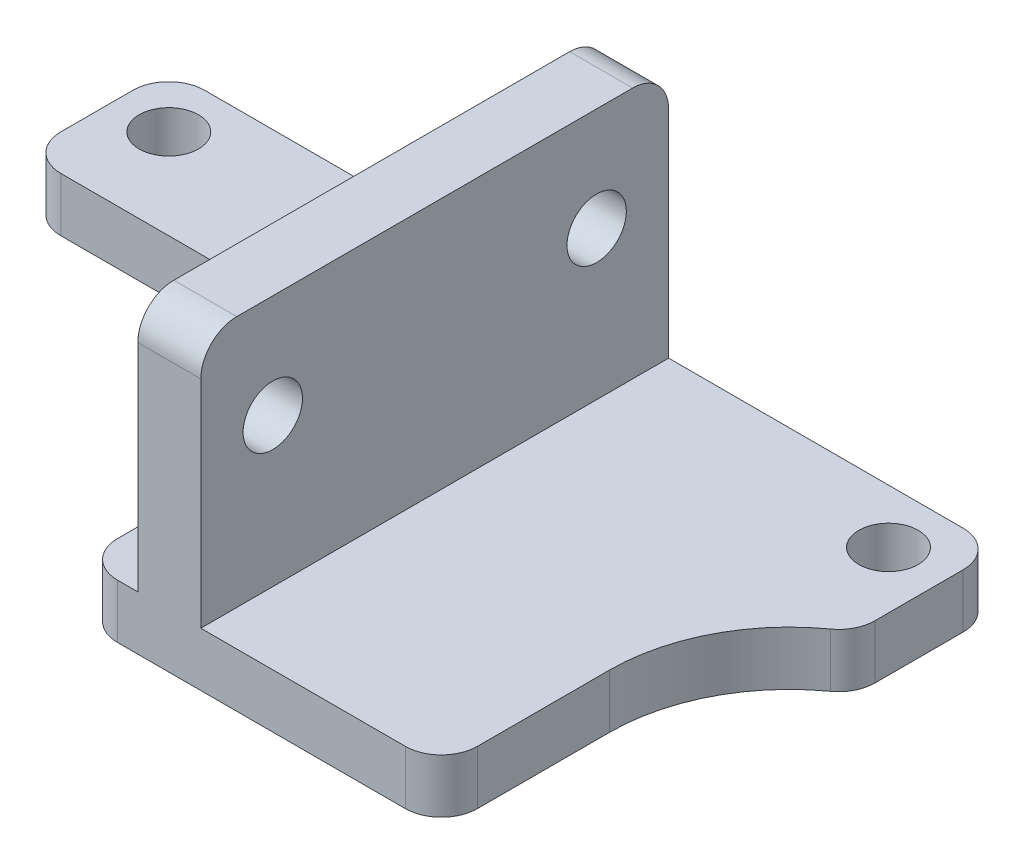
ISO-10303-21;
HEADER;
FILE_DESCRIPTION(('STEP AP214'),'2;1');
FILE_NAME('part.step','',(''),(''),'','','');
FILE_SCHEMA(('AUTOMOTIVE_DESIGN { 1 0 10303 214 1 1 1 1 }'));
ENDSEC;
DATA;
#1=APPLICATION_CONTEXT('core data for automotive mechanical design processes');
#2=APPLICATION_PROTOCOL_DEFINITION('international standard','automotive_design',2000,#1);
#3=PRODUCT_CONTEXT('',#1,'mechanical');
#4=PRODUCT('Part','Part','',(#3));
#5=PRODUCT_RELATED_PRODUCT_CATEGORY('part','',(#4));
#6=PRODUCT_DEFINITION_FORMATION('','',#4);
#7=PRODUCT_DEFINITION_CONTEXT('part definition',#1,'design');
#8=PRODUCT_DEFINITION('design','',#6,#7);
#9=PRODUCT_DEFINITION_SHAPE('','',#8);
#10=(LENGTH_UNIT() NAMED_UNIT(*) SI_UNIT(.MILLI.,.METRE.));
#11=(NAMED_UNIT(*) PLANE_ANGLE_UNIT() SI_UNIT($,.RADIAN.));
#12=(NAMED_UNIT(*) SI_UNIT($,.STERADIAN.) SOLID_ANGLE_UNIT());
#13=UNCERTAINTY_MEASURE_WITH_UNIT(LENGTH_MEASURE(1.E-05),#10,'distance_accuracy_value','');
#14=(GEOMETRIC_REPRESENTATION_CONTEXT(3) GLOBAL_UNCERTAINTY_ASSIGNED_CONTEXT((#13)) GLOBAL_UNIT_ASSIGNED_CONTEXT((#10,
#11,#12)) REPRESENTATION_CONTEXT('',''));
#15=CARTESIAN_POINT('',(0.,0.,0.));
#16=DIRECTION('',(0.,0.,1.));
#17=DIRECTION('',(1.,0.,0.));
#18=AXIS2_PLACEMENT_3D('',#15,#16,#17);
#19=CARTESIAN_POINT('',(0.,3.,26.));
#20=DIRECTION('',(1.,0.,0.));
#21=DIRECTION('',(0.,0.,-1.));
#22=AXIS2_PLACEMENT_3D('',#19,#20,#21);
#23=PLANE('',#22);
#24=DIRECTION('',(0.,0.,1.));
#25=VECTOR('',#24,1.);
#26=CARTESIAN_POINT('',(0.,0.,26.));
#27=LINE('',#26,#25);
#28=CARTESIAN_POINT('',(0.,0.,18.));
#29=VERTEX_POINT('',#28);
#30=CARTESIAN_POINT('',(0.,0.,24.));
#31=VERTEX_POINT('',#30);
#32=EDGE_CURVE('E313',#29,#31,#27,.T.);
#33=ORIENTED_EDGE('',*,*,#32,.T.);
#34=DIRECTION('',(0.,-1.,0.));
#35=VECTOR('',#34,1.);
#36=CARTESIAN_POINT('',(0.,3.,24.));
#37=LINE('',#36,#35);
#38=CARTESIAN_POINT('',(0.,3.,24.));
#39=VERTEX_POINT('',#38);
#40=EDGE_CURVE('E225',#31,#39,#37,.F.);
#41=ORIENTED_EDGE('',*,*,#40,.T.);
#42=DIRECTION('',(0.,0.,1.));
#43=VECTOR('',#42,1.);
#44=CARTESIAN_POINT('',(0.,3.,26.));
#45=LINE('',#44,#43);
#46=CARTESIAN_POINT('',(0.,3.,18.));
#47=VERTEX_POINT('',#46);
#48=EDGE_CURVE('E304',#47,#39,#45,.T.);
#49=ORIENTED_EDGE('',*,*,#48,.F.);
#50=DIRECTION('',(0.,1.,0.));
#51=VECTOR('',#50,1.);
#52=CARTESIAN_POINT('',(0.,3.,18.));
#53=LINE('',#52,#51);
#54=EDGE_CURVE('E295',#47,#29,#53,.F.);
#55=ORIENTED_EDGE('',*,*,#54,.T.);
#56=EDGE_LOOP('',(#33,#41,#49,#55));
#57=FACE_BOUND('',#56,.T.);
#58=ADVANCED_FACE('F41',(#57),#23,.F.);
#59=CARTESIAN_POINT('',(0.,3.,0.));
#60=DIRECTION('',(0.,-1.,0.));
#61=DIRECTION('',(0.,0.,-1.));
#62=AXIS2_PLACEMENT_3D('',#59,#60,#61);
#63=PLANE('',#62);
#64=DIRECTION('',(0.,0.,1.));
#65=VECTOR('',#64,1.);
#66=CARTESIAN_POINT('',(3.13,3.,26.));
#67=LINE('',#66,#65);
#68=CARTESIAN_POINT('',(3.13,3.,5.74989593923522));
#69=VERTEX_POINT('',#68);
#70=CARTESIAN_POINT('',(3.13,3.,26.));
#71=VERTEX_POINT('',#70);
#72=EDGE_CURVE('E351',#69,#71,#67,.T.);
#73=ORIENTED_EDGE('',*,*,#72,.F.);
#74=CARTESIAN_POINT('',(3.15392328073625,3.,2.99999999999701));
#75=DIRECTION('',(0.,-1.,0.));
#76=DIRECTION('',(0.,0.,-1.));
#77=AXIS2_PLACEMENT_3D('',#74,#75,#76);
#78=CIRCLE('',#77,2.75);
#79=CARTESIAN_POINT('',(3.13,3.,0.250104060758797));
#80=VERTEX_POINT('',#79);
#81=EDGE_CURVE('E203',#69,#80,#78,.T.);
#82=ORIENTED_EDGE('',*,*,#81,.T.);
#83=CARTESIAN_POINT('',(3.13,3.,0.));
#84=VERTEX_POINT('',#83);
#85=EDGE_CURVE('E209',#84,#80,#67,.T.);
#86=ORIENTED_EDGE('',*,*,#85,.F.);
#87=DIRECTION('',(-1.,0.,0.));
#88=VECTOR('',#87,1.);
#89=CARTESIAN_POINT('',(0.,3.,0.));
#90=LINE('',#89,#88);
#91=CARTESIAN_POINT('',(-19.15,3.,0.));
#92=VERTEX_POINT('',#91);
#93=EDGE_CURVE('E319',#84,#92,#90,.T.);
#94=ORIENTED_EDGE('',*,*,#93,.T.);
#95=CARTESIAN_POINT('',(-19.15,3.,2.));
#96=DIRECTION('',(0.,-1.,0.));
#97=DIRECTION('',(0.,0.,-1.));
#98=AXIS2_PLACEMENT_3D('',#95,#96,#97);
#99=CIRCLE('',#98,2.);
#100=CARTESIAN_POINT('',(-21.15,3.,2.));
#101=VERTEX_POINT('',#100);
#102=EDGE_CURVE('E223',#92,#101,#99,.F.);
#103=ORIENTED_EDGE('',*,*,#102,.T.);
#104=DIRECTION('',(0.,0.,1.));
#105=VECTOR('',#104,1.);
#106=CARTESIAN_POINT('',(-21.15,3.,0.));
#107=LINE('',#106,#105);
#108=CARTESIAN_POINT('',(-21.15,3.,6.));
#109=VERTEX_POINT('',#108);
#110=EDGE_CURVE('E369',#101,#109,#107,.T.);
#111=ORIENTED_EDGE('',*,*,#110,.T.);
#112=CARTESIAN_POINT('',(-19.15,3.,6.));
#113=DIRECTION('',(0.,-1.,0.));
#114=DIRECTION('',(0.,0.,-1.));
#115=AXIS2_PLACEMENT_3D('',#112,#113,#114);
#116=CIRCLE('',#115,2.);
#117=CARTESIAN_POINT('',(-19.15,3.,8.));
#118=VERTEX_POINT('',#117);
#119=EDGE_CURVE('E63',#109,#118,#116,.F.);
#120=ORIENTED_EDGE('',*,*,#119,.T.);
#121=DIRECTION('',(1.,0.,0.));
#122=VECTOR('',#121,1.);
#123=CARTESIAN_POINT('',(0.,3.,8.));
#124=LINE('',#123,#122);
#125=CARTESIAN_POINT('',(-10.,3.,8.));
#126=VERTEX_POINT('',#125);
#127=EDGE_CURVE('E366',#118,#126,#124,.T.);
#128=ORIENTED_EDGE('',*,*,#127,.T.);
#129=CARTESIAN_POINT('',(-10.,3.,18.));
#130=DIRECTION('',(0.,-1.,0.));
#131=DIRECTION('',(0.,0.,-1.));
#132=AXIS2_PLACEMENT_3D('',#129,#130,#131);
#133=CIRCLE('',#132,10.);
#134=EDGE_CURVE('E290',#126,#47,#133,.T.);
#135=ORIENTED_EDGE('',*,*,#134,.T.);
#136=ORIENTED_EDGE('',*,*,#48,.T.);
#137=CARTESIAN_POINT('',(2.,3.,24.));
#138=DIRECTION('',(0.,-1.,0.));
#139=DIRECTION('',(0.,0.,-1.));
#140=AXIS2_PLACEMENT_3D('',#137,#138,#139);
#141=CIRCLE('',#140,2.);
#142=CARTESIAN_POINT('',(2.,3.,26.));
#143=VERTEX_POINT('',#142);
#144=EDGE_CURVE('E220',#39,#143,#141,.F.);
#145=ORIENTED_EDGE('',*,*,#144,.T.);
#146=DIRECTION('',(1.,0.,0.));
#147=VECTOR('',#146,1.);
#148=CARTESIAN_POINT('',(20.,3.,26.));
#149=LINE('',#148,#147);
#150=EDGE_CURVE('E325',#143,#71,#149,.T.);
#151=ORIENTED_EDGE('',*,*,#150,.T.);
#152=EDGE_LOOP('',(#73,#82,#86,#94,#103,#111,#120,#128,#135,#136,#145,#151));
#153=FACE_BOUND('',#152,.T.);
#154=CARTESIAN_POINT('',(-18.15,3.,3.));
#155=DIRECTION('',(0.,1.,0.));
#156=DIRECTION('',(0.,0.,1.));
#157=AXIS2_PLACEMENT_3D('',#154,#155,#156);
#158=CIRCLE('',#157,1.65);
#159=CARTESIAN_POINT('',(-18.15,3.,4.65));
#160=VERTEX_POINT('',#159);
#161=EDGE_CURVE('E359',#160,#160,#158,.T.);
#162=ORIENTED_EDGE('',*,*,#161,.F.);
#163=EDGE_LOOP('',(#162));
#164=FACE_BOUND('',#163,.T.);
#165=ADVANCED_FACE('F419',(#153,#164),#63,.F.);
#166=CARTESIAN_POINT('',(21.85,3.,3.));
#167=DIRECTION('',(0.,1.,0.));
#168=DIRECTION('',(0.,0.,1.));
#169=AXIS2_PLACEMENT_3D('',#166,#167,#168);
#170=CIRCLE('',#169,1.65);
#171=CARTESIAN_POINT('',(21.85,3.,4.65));
#172=VERTEX_POINT('',#171);
#173=EDGE_CURVE('E316',#172,#172,#170,.T.);
#174=ORIENTED_EDGE('',*,*,#173,.F.);
#175=EDGE_LOOP('',(#174));
#176=FACE_BOUND('',#175,.T.);
#177=CARTESIAN_POINT('',(30.,3.,16.6602540378444));
#178=DIRECTION('',(0.,-1.,0.));
#179=DIRECTION('',(0.,0.,-1.));
#180=AXIS2_PLACEMENT_3D('',#177,#178,#179);
#181=CIRCLE('',#180,10.);
#182=CARTESIAN_POINT('',(20.,3.,16.6602540378444));
#183=VERTEX_POINT('',#182);
#184=CARTESIAN_POINT('',(24.1666666666667,3.,8.53792541717025));
#185=VERTEX_POINT('',#184);
#186=EDGE_CURVE('E281',#183,#185,#181,.T.);
#187=ORIENTED_EDGE('',*,*,#186,.T.);
#188=CARTESIAN_POINT('',(23.,3.,6.91345969303542));
#189=DIRECTION('',(0.,-1.,0.));
#190=DIRECTION('',(0.,0.,-1.));
#191=AXIS2_PLACEMENT_3D('',#188,#189,#190);
#192=CIRCLE('',#191,2.);
#193=CARTESIAN_POINT('',(25.,3.,6.91345969303542));
#194=VERTEX_POINT('',#193);
#195=EDGE_CURVE('E256',#185,#194,#192,.F.);
#196=ORIENTED_EDGE('',*,*,#195,.T.);
#197=DIRECTION('',(0.,0.,-1.));
#198=VECTOR('',#197,1.);
#199=CARTESIAN_POINT('',(25.,3.,0.));
#200=LINE('',#199,#198);
#201=CARTESIAN_POINT('',(25.,3.,2.));
#202=VERTEX_POINT('',#201);
#203=EDGE_CURVE('E320',#194,#202,#200,.T.);
#204=ORIENTED_EDGE('',*,*,#203,.T.);
#205=CARTESIAN_POINT('',(23.,3.,2.));
#206=DIRECTION('',(0.,-1.,0.));
#207=DIRECTION('',(0.,0.,-1.));
#208=AXIS2_PLACEMENT_3D('',#205,#206,#207);
#209=CIRCLE('',#208,2.);
#210=CARTESIAN_POINT('',(23.,3.,0.));
#211=VERTEX_POINT('',#210);
#212=EDGE_CURVE('E260',#202,#211,#209,.F.);
#213=ORIENTED_EDGE('',*,*,#212,.T.);
#214=CARTESIAN_POINT('',(6.63,3.,0.));
#215=VERTEX_POINT('',#214);
#216=EDGE_CURVE('E300',#211,#215,#90,.T.);
#217=ORIENTED_EDGE('',*,*,#216,.T.);
#218=DIRECTION('',(0.,0.,-1.));
#219=VECTOR('',#218,1.);
#220=CARTESIAN_POINT('',(6.63,3.,26.));
#221=LINE('',#220,#219);
#222=CARTESIAN_POINT('',(6.63,3.,26.));
#223=VERTEX_POINT('',#222);
#224=EDGE_CURVE('E346',#223,#215,#221,.T.);
#225=ORIENTED_EDGE('',*,*,#224,.F.);
#226=CARTESIAN_POINT('',(18.,3.,26.));
#227=VERTEX_POINT('',#226);
#228=EDGE_CURVE('E328',#223,#227,#149,.T.);
#229=ORIENTED_EDGE('',*,*,#228,.T.);
#230=CARTESIAN_POINT('',(18.,3.,24.));
#231=DIRECTION('',(0.,-1.,0.));
#232=DIRECTION('',(0.,0.,-1.));
#233=AXIS2_PLACEMENT_3D('',#230,#231,#232);
#234=CIRCLE('',#233,2.);
#235=CARTESIAN_POINT('',(20.,3.,24.));
#236=VERTEX_POINT('',#235);
#237=EDGE_CURVE('E258',#227,#236,#234,.F.);
#238=ORIENTED_EDGE('',*,*,#237,.T.);
#239=DIRECTION('',(0.,0.,-1.));
#240=VECTOR('',#239,1.);
#241=CARTESIAN_POINT('',(20.,3.,8.));
#242=LINE('',#241,#240);
#243=EDGE_CURVE('E323',#236,#183,#242,.T.);
#244=ORIENTED_EDGE('',*,*,#243,.T.);
#245=EDGE_LOOP('',(#187,#196,#204,#213,#217,#225,#229,#238,#244));
#246=FACE_BOUND('',#245,.T.);
#247=ADVANCED_FACE('F392',(#176,#246),#63,.F.);
#248=CARTESIAN_POINT('',(0.,0.,0.));
#249=DIRECTION('',(0.,-1.,0.));
#250=DIRECTION('',(0.,0.,-1.));
#251=AXIS2_PLACEMENT_3D('',#248,#249,#250);
#252=PLANE('',#251);
#253=CARTESIAN_POINT('',(3.15392328073625,0.,2.99999999999701));
#254=DIRECTION('',(0.,-1.,0.));
#255=DIRECTION('',(0.,0.,-1.));
#256=AXIS2_PLACEMENT_3D('',#253,#254,#255);
#257=CIRCLE('',#256,2.75);
#258=CARTESIAN_POINT('',(3.15392328073625,0.,0.24999999999701));
#259=VERTEX_POINT('',#258);
#260=EDGE_CURVE('E204',#259,#259,#257,.T.);
#261=ORIENTED_EDGE('',*,*,#260,.F.);
#262=EDGE_LOOP('',(#261));
#263=FACE_BOUND('',#262,.T.);
#264=DIRECTION('',(0.,0.,-1.));
#265=VECTOR('',#264,1.);
#266=CARTESIAN_POINT('',(25.,0.,0.));
#267=LINE('',#266,#265);
#268=CARTESIAN_POINT('',(25.,0.,6.91345969303542));
#269=VERTEX_POINT('',#268);
#270=CARTESIAN_POINT('',(25.,0.,2.));
#271=VERTEX_POINT('',#270);
#272=EDGE_CURVE('E305',#269,#271,#267,.T.);
#273=ORIENTED_EDGE('',*,*,#272,.F.);
#274=CARTESIAN_POINT('',(23.,0.,6.91345969303542));
#275=DIRECTION('',(0.,-1.,0.));
#276=DIRECTION('',(0.,0.,-1.));
#277=AXIS2_PLACEMENT_3D('',#274,#275,#276);
#278=CIRCLE('',#277,2.);
#279=CARTESIAN_POINT('',(24.1666666666667,0.,8.53792541717025));
#280=VERTEX_POINT('',#279);
#281=EDGE_CURVE('E264',#269,#280,#278,.T.);
#282=ORIENTED_EDGE('',*,*,#281,.T.);
#283=CARTESIAN_POINT('',(30.,0.,16.6602540378444));
#284=DIRECTION('',(0.,-1.,0.));
#285=DIRECTION('',(0.,0.,-1.));
#286=AXIS2_PLACEMENT_3D('',#283,#284,#285);
#287=CIRCLE('',#286,10.);
#288=CARTESIAN_POINT('',(20.,0.,16.6602540378444));
#289=VERTEX_POINT('',#288);
#290=EDGE_CURVE('E284',#280,#289,#287,.F.);
#291=ORIENTED_EDGE('',*,*,#290,.T.);
#292=DIRECTION('',(0.,0.,-1.));
#293=VECTOR('',#292,1.);
#294=CARTESIAN_POINT('',(20.,0.,8.));
#295=LINE('',#294,#293);
#296=CARTESIAN_POINT('',(20.,0.,24.));
#297=VERTEX_POINT('',#296);
#298=EDGE_CURVE('E308',#297,#289,#295,.T.);
#299=ORIENTED_EDGE('',*,*,#298,.F.);
#300=CARTESIAN_POINT('',(18.,0.,24.));
#301=DIRECTION('',(0.,-1.,0.));
#302=DIRECTION('',(0.,0.,-1.));
#303=AXIS2_PLACEMENT_3D('',#300,#301,#302);
#304=CIRCLE('',#303,2.);
#305=CARTESIAN_POINT('',(18.,0.,26.));
#306=VERTEX_POINT('',#305);
#307=EDGE_CURVE('E268',#297,#306,#304,.T.);
#308=ORIENTED_EDGE('',*,*,#307,.T.);
#309=DIRECTION('',(1.,0.,0.));
#310=VECTOR('',#309,1.);
#311=CARTESIAN_POINT('',(20.,0.,26.));
#312=LINE('',#311,#310);
#313=CARTESIAN_POINT('',(2.,0.,26.));
#314=VERTEX_POINT('',#313);
#315=EDGE_CURVE('E310',#314,#306,#312,.T.);
#316=ORIENTED_EDGE('',*,*,#315,.F.);
#317=CARTESIAN_POINT('',(2.,0.,24.));
#318=DIRECTION('',(0.,-1.,0.));
#319=DIRECTION('',(0.,0.,-1.));
#320=AXIS2_PLACEMENT_3D('',#317,#318,#319);
#321=CIRCLE('',#320,2.);
#322=EDGE_CURVE('E266',#314,#31,#321,.T.);
#323=ORIENTED_EDGE('',*,*,#322,.T.);
#324=ORIENTED_EDGE('',*,*,#32,.F.);
#325=CARTESIAN_POINT('',(-10.,0.,18.));
#326=DIRECTION('',(0.,-1.,0.));
#327=DIRECTION('',(0.,0.,-1.));
#328=AXIS2_PLACEMENT_3D('',#325,#326,#327);
#329=CIRCLE('',#328,10.);
#330=CARTESIAN_POINT('',(-10.,0.,8.));
#331=VERTEX_POINT('',#330);
#332=EDGE_CURVE('E287',#29,#331,#329,.F.);
#333=ORIENTED_EDGE('',*,*,#332,.T.);
#334=DIRECTION('',(1.,0.,0.));
#335=VECTOR('',#334,1.);
#336=CARTESIAN_POINT('',(0.,0.,8.));
#337=LINE('',#336,#335);
#338=CARTESIAN_POINT('',(-19.15,0.,8.));
#339=VERTEX_POINT('',#338);
#340=EDGE_CURVE('E360',#339,#331,#337,.T.);
#341=ORIENTED_EDGE('',*,*,#340,.F.);
#342=CARTESIAN_POINT('',(-19.15,0.,6.));
#343=DIRECTION('',(0.,-1.,0.));
#344=DIRECTION('',(0.,0.,-1.));
#345=AXIS2_PLACEMENT_3D('',#342,#343,#344);
#346=CIRCLE('',#345,2.);
#347=CARTESIAN_POINT('',(-21.15,0.,6.));
#348=VERTEX_POINT('',#347);
#349=EDGE_CURVE('E270',#339,#348,#346,.T.);
#350=ORIENTED_EDGE('',*,*,#349,.T.);
#351=DIRECTION('',(0.,0.,1.));
#352=VECTOR('',#351,1.);
#353=CARTESIAN_POINT('',(-21.15,0.,0.));
#354=LINE('',#353,#352);
#355=CARTESIAN_POINT('',(-21.15,0.,2.));
#356=VERTEX_POINT('',#355);
#357=EDGE_CURVE('E356',#356,#348,#354,.T.);
#358=ORIENTED_EDGE('',*,*,#357,.F.);
#359=CARTESIAN_POINT('',(-19.15,0.,2.));
#360=DIRECTION('',(0.,-1.,0.));
#361=DIRECTION('',(0.,0.,-1.));
#362=AXIS2_PLACEMENT_3D('',#359,#360,#361);
#363=CIRCLE('',#362,2.);
#364=CARTESIAN_POINT('',(-19.15,0.,0.));
#365=VERTEX_POINT('',#364);
#366=EDGE_CURVE('E272',#356,#365,#363,.T.);
#367=ORIENTED_EDGE('',*,*,#366,.T.);
#368=DIRECTION('',(-1.,0.,0.));
#369=VECTOR('',#368,1.);
#370=CARTESIAN_POINT('',(0.,0.,0.));
#371=LINE('',#370,#369);
#372=CARTESIAN_POINT('',(23.,0.,0.));
#373=VERTEX_POINT('',#372);
#374=EDGE_CURVE('E301',#373,#365,#371,.T.);
#375=ORIENTED_EDGE('',*,*,#374,.F.);
#376=CARTESIAN_POINT('',(23.,0.,2.));
#377=DIRECTION('',(0.,-1.,0.));
#378=DIRECTION('',(0.,0.,-1.));
#379=AXIS2_PLACEMENT_3D('',#376,#377,#378);
#380=CIRCLE('',#379,2.);
#381=EDGE_CURVE('E274',#373,#271,#380,.T.);
#382=ORIENTED_EDGE('',*,*,#381,.T.);
#383=EDGE_LOOP('',(#273,#282,#291,#299,#308,#316,#323,#324,#333,#341,#350,#358,#367,#375,#382));
#384=FACE_BOUND('',#383,.T.);
#385=CARTESIAN_POINT('',(21.85,0.,3.));
#386=DIRECTION('',(0.,1.,0.));
#387=DIRECTION('',(0.,0.,1.));
#388=AXIS2_PLACEMENT_3D('',#385,#386,#387);
#389=CIRCLE('',#388,1.65);
#390=CARTESIAN_POINT('',(21.85,0.,4.65));
#391=VERTEX_POINT('',#390);
#392=EDGE_CURVE('E331',#391,#391,#389,.T.);
#393=ORIENTED_EDGE('',*,*,#392,.T.);
#394=EDGE_LOOP('',(#393));
#395=FACE_BOUND('',#394,.T.);
#396=CARTESIAN_POINT('',(-18.15,0.,3.));
#397=DIRECTION('',(0.,-1.,0.));
#398=DIRECTION('',(0.,0.,-1.));
#399=AXIS2_PLACEMENT_3D('',#396,#397,#398);
#400=CIRCLE('',#399,1.65);
#401=CARTESIAN_POINT('',(-18.15,0.,1.35000000000001));
#402=VERTEX_POINT('',#401);
#403=EDGE_CURVE('E363',#402,#402,#400,.F.);
#404=ORIENTED_EDGE('',*,*,#403,.T.);
#405=EDGE_LOOP('',(#404));
#406=FACE_BOUND('',#405,.T.);
#407=ADVANCED_FACE('F388',(#263,#384,#395,#406),#252,.T.);
#408=CARTESIAN_POINT('',(20.,3.,26.));
#409=DIRECTION('',(0.,0.,-1.));
#410=DIRECTION('',(-1.,0.,0.));
#411=AXIS2_PLACEMENT_3D('',#408,#409,#410);
#412=PLANE('',#411);
#413=DIRECTION('',(0.,-1.,0.));
#414=VECTOR('',#413,1.);
#415=CARTESIAN_POINT('',(6.63,17.,26.));
#416=LINE('',#415,#414);
#417=CARTESIAN_POINT('',(6.63,15.,26.));
#418=VERTEX_POINT('',#417);
#419=EDGE_CURVE('E339',#418,#223,#416,.T.);
#420=ORIENTED_EDGE('',*,*,#419,.F.);
#421=DIRECTION('',(1.,0.,0.));
#422=VECTOR('',#421,1.);
#423=CARTESIAN_POINT('',(3.13,15.,26.));
#424=LINE('',#423,#422);
#425=CARTESIAN_POINT('',(3.13,15.,26.));
#426=VERTEX_POINT('',#425);
#427=EDGE_CURVE('E227',#418,#426,#424,.F.);
#428=ORIENTED_EDGE('',*,*,#427,.T.);
#429=DIRECTION('',(0.,-1.,0.));
#430=VECTOR('',#429,1.);
#431=CARTESIAN_POINT('',(3.13,17.,26.));
#432=LINE('',#431,#430);
#433=EDGE_CURVE('E334',#426,#71,#432,.T.);
#434=ORIENTED_EDGE('',*,*,#433,.T.);
#435=ORIENTED_EDGE('',*,*,#150,.F.);
#436=DIRECTION('',(0.,-1.,0.));
#437=VECTOR('',#436,1.);
#438=CARTESIAN_POINT('',(2.,3.,26.));
#439=LINE('',#438,#437);
#440=EDGE_CURVE('E229',#143,#314,#439,.T.);
#441=ORIENTED_EDGE('',*,*,#440,.T.);
#442=ORIENTED_EDGE('',*,*,#315,.T.);
#443=DIRECTION('',(0.,-1.,0.));
#444=VECTOR('',#443,1.);
#445=CARTESIAN_POINT('',(18.,3.,26.));
#446=LINE('',#445,#444);
#447=EDGE_CURVE('E232',#306,#227,#446,.F.);
#448=ORIENTED_EDGE('',*,*,#447,.T.);
#449=ORIENTED_EDGE('',*,*,#228,.F.);
#450=EDGE_LOOP('',(#420,#428,#434,#435,#441,#442,#448,#449));
#451=FACE_BOUND('',#450,.T.);
#452=ADVANCED_FACE('F391',(#451),#412,.F.);
#453=CARTESIAN_POINT('',(20.,3.,8.));
#454=DIRECTION('',(-1.,0.,0.));
#455=DIRECTION('',(0.,0.,1.));
#456=AXIS2_PLACEMENT_3D('',#453,#454,#455);
#457=PLANE('',#456);
#458=ORIENTED_EDGE('',*,*,#243,.F.);
#459=DIRECTION('',(0.,-1.,0.));
#460=VECTOR('',#459,1.);
#461=CARTESIAN_POINT('',(20.,3.,24.));
#462=LINE('',#461,#460);
#463=EDGE_CURVE('E217',#236,#297,#462,.T.);
#464=ORIENTED_EDGE('',*,*,#463,.T.);
#465=ORIENTED_EDGE('',*,*,#298,.T.);
#466=DIRECTION('',(0.,1.,0.));
#467=VECTOR('',#466,1.);
#468=CARTESIAN_POINT('',(20.,3.,16.6602540378444));
#469=LINE('',#468,#467);
#470=EDGE_CURVE('E292',#289,#183,#469,.T.);
#471=ORIENTED_EDGE('',*,*,#470,.T.);
#472=EDGE_LOOP('',(#458,#464,#465,#471));
#473=FACE_BOUND('',#472,.T.);
#474=ADVANCED_FACE('F494',(#473),#457,.F.);
#475=CARTESIAN_POINT('',(25.,3.,0.));
#476=DIRECTION('',(-1.,0.,0.));
#477=DIRECTION('',(0.,0.,1.));
#478=AXIS2_PLACEMENT_3D('',#475,#476,#477);
#479=PLANE('',#478);
#480=ORIENTED_EDGE('',*,*,#203,.F.);
#481=DIRECTION('',(0.,1.,0.));
#482=VECTOR('',#481,1.);
#483=CARTESIAN_POINT('',(25.,3.,6.91345969303542));
#484=LINE('',#483,#482);
#485=EDGE_CURVE('E276',#194,#269,#484,.F.);
#486=ORIENTED_EDGE('',*,*,#485,.T.);
#487=ORIENTED_EDGE('',*,*,#272,.T.);
#488=DIRECTION('',(0.,-1.,0.));
#489=VECTOR('',#488,1.);
#490=CARTESIAN_POINT('',(25.,3.,2.));
#491=LINE('',#490,#489);
#492=EDGE_CURVE('E279',#271,#202,#491,.F.);
#493=ORIENTED_EDGE('',*,*,#492,.T.);
#494=EDGE_LOOP('',(#480,#486,#487,#493));
#495=FACE_BOUND('',#494,.T.);
#496=ADVANCED_FACE('F484',(#495),#479,.F.);
#497=CARTESIAN_POINT('',(0.,3.,0.));
#498=DIRECTION('',(0.,0.,1.));
#499=DIRECTION('',(1.,0.,0.));
#500=AXIS2_PLACEMENT_3D('',#497,#498,#499);
#501=PLANE('',#500);
#502=DIRECTION('',(0.,-1.,0.));
#503=VECTOR('',#502,1.);
#504=CARTESIAN_POINT('',(3.13,17.,0.));
#505=LINE('',#504,#503);
#506=CARTESIAN_POINT('',(3.13,15.,0.));
#507=VERTEX_POINT('',#506);
#508=EDGE_CURVE('E343',#507,#84,#505,.T.);
#509=ORIENTED_EDGE('',*,*,#508,.F.);
#510=DIRECTION('',(-1.,0.,0.));
#511=VECTOR('',#510,1.);
#512=CARTESIAN_POINT('',(6.63,15.,0.));
#513=LINE('',#512,#511);
#514=CARTESIAN_POINT('',(6.63,15.,0.));
#515=VERTEX_POINT('',#514);
#516=EDGE_CURVE('E238',#507,#515,#513,.F.);
#517=ORIENTED_EDGE('',*,*,#516,.T.);
#518=DIRECTION('',(0.,-1.,0.));
#519=VECTOR('',#518,1.);
#520=CARTESIAN_POINT('',(6.63,17.,0.));
#521=LINE('',#520,#519);
#522=EDGE_CURVE('E341',#515,#215,#521,.T.);
#523=ORIENTED_EDGE('',*,*,#522,.T.);
#524=ORIENTED_EDGE('',*,*,#216,.F.);
#525=DIRECTION('',(0.,-1.,0.));
#526=VECTOR('',#525,1.);
#527=CARTESIAN_POINT('',(23.,3.,0.));
#528=LINE('',#527,#526);
#529=EDGE_CURVE('E243',#211,#373,#528,.T.);
#530=ORIENTED_EDGE('',*,*,#529,.T.);
#531=ORIENTED_EDGE('',*,*,#374,.T.);
#532=DIRECTION('',(0.,1.,0.));
#533=VECTOR('',#532,1.);
#534=CARTESIAN_POINT('',(-19.15,3.,0.));
#535=LINE('',#534,#533);
#536=EDGE_CURVE('E240',#365,#92,#535,.T.);
#537=ORIENTED_EDGE('',*,*,#536,.T.);
#538=ORIENTED_EDGE('',*,*,#93,.F.);
#539=EDGE_LOOP('',(#509,#517,#523,#524,#530,#531,#537,#538));
#540=FACE_BOUND('',#539,.T.);
#541=ADVANCED_FACE('F475',(#540),#501,.F.);
#542=CARTESIAN_POINT('',(21.85,3.,3.));
#543=DIRECTION('',(0.,-1.,0.));
#544=DIRECTION('',(0.,0.,-1.));
#545=AXIS2_PLACEMENT_3D('',#542,#543,#544);
#546=CYLINDRICAL_SURFACE('',#545,1.65);
#547=ORIENTED_EDGE('',*,*,#173,.T.);
#548=EDGE_LOOP('',(#547));
#549=FACE_BOUND('',#548,.T.);
#550=ORIENTED_EDGE('',*,*,#392,.F.);
#551=EDGE_LOOP('',(#550));
#552=FACE_BOUND('',#551,.T.);
#553=ADVANCED_FACE('F577',(#549,#552),#546,.F.);
#554=CARTESIAN_POINT('',(3.13,17.,26.));
#555=DIRECTION('',(1.,0.,0.));
#556=DIRECTION('',(0.,0.,-1.));
#557=AXIS2_PLACEMENT_3D('',#554,#555,#556);
#558=PLANE('',#557);
#559=CARTESIAN_POINT('',(3.13,11.25,4.));
#560=DIRECTION('',(1.,0.,0.));
#561=DIRECTION('',(0.,0.,-1.));
#562=AXIS2_PLACEMENT_3D('',#559,#560,#561);
#563=CIRCLE('',#562,1.65);
#564=CARTESIAN_POINT('',(3.13,11.25,2.35));
#565=VERTEX_POINT('',#564);
#566=EDGE_CURVE('E362',#565,#565,#563,.T.);
#567=ORIENTED_EDGE('',*,*,#566,.T.);
#568=EDGE_LOOP('',(#567));
#569=FACE_BOUND('',#568,.T.);
#570=CARTESIAN_POINT('',(3.13,11.25,22.));
#571=DIRECTION('',(1.,0.,0.));
#572=DIRECTION('',(0.,0.,-1.));
#573=AXIS2_PLACEMENT_3D('',#570,#571,#572);
#574=CIRCLE('',#573,1.65);
#575=CARTESIAN_POINT('',(3.13,11.25,20.35));
#576=VERTEX_POINT('',#575);
#577=EDGE_CURVE('E374',#576,#576,#574,.T.);
#578=ORIENTED_EDGE('',*,*,#577,.T.);
#579=EDGE_LOOP('',(#578));
#580=FACE_BOUND('',#579,.T.);
#581=DIRECTION('',(0.,0.,-1.));
#582=VECTOR('',#581,1.);
#583=CARTESIAN_POINT('',(3.13,4.1,26.));
#584=LINE('',#583,#582);
#585=CARTESIAN_POINT('',(3.13,4.1,5.74989593923522));
#586=VERTEX_POINT('',#585);
#587=CARTESIAN_POINT('',(3.13,4.1,0.250104060758797));
#588=VERTEX_POINT('',#587);
#589=EDGE_CURVE('E194',#586,#588,#584,.T.);
#590=ORIENTED_EDGE('',*,*,#589,.F.);
#591=DIRECTION('',(0.,-1.,0.));
#592=VECTOR('',#591,1.);
#593=CARTESIAN_POINT('',(3.13,4.1,5.74989593923522));
#594=LINE('',#593,#592);
#595=EDGE_CURVE('E11',#586,#69,#594,.T.);
#596=ORIENTED_EDGE('',*,*,#595,.T.);
#597=ORIENTED_EDGE('',*,*,#72,.T.);
#598=ORIENTED_EDGE('',*,*,#433,.F.);
#599=CARTESIAN_POINT('',(3.13,15.,24.));
#600=DIRECTION('',(1.,0.,0.));
#601=DIRECTION('',(0.,0.,-1.));
#602=AXIS2_PLACEMENT_3D('',#599,#600,#601);
#603=CIRCLE('',#602,2.);
#604=CARTESIAN_POINT('',(3.13,17.,24.));
#605=VERTEX_POINT('',#604);
#606=EDGE_CURVE('E248',#426,#605,#603,.F.);
#607=ORIENTED_EDGE('',*,*,#606,.T.);
#608=DIRECTION('',(0.,0.,1.));
#609=VECTOR('',#608,1.);
#610=CARTESIAN_POINT('',(3.13,17.,26.));
#611=LINE('',#610,#609);
#612=CARTESIAN_POINT('',(3.13,17.,2.00000000000001));
#613=VERTEX_POINT('',#612);
#614=EDGE_CURVE('E349',#613,#605,#611,.T.);
#615=ORIENTED_EDGE('',*,*,#614,.F.);
#616=CARTESIAN_POINT('',(3.13,15.,2.));
#617=DIRECTION('',(1.,0.,0.));
#618=DIRECTION('',(0.,0.,-1.));
#619=AXIS2_PLACEMENT_3D('',#616,#617,#618);
#620=CIRCLE('',#619,2.);
#621=EDGE_CURVE('E246',#613,#507,#620,.F.);
#622=ORIENTED_EDGE('',*,*,#621,.T.);
#623=ORIENTED_EDGE('',*,*,#508,.T.);
#624=ORIENTED_EDGE('',*,*,#85,.T.);
#625=DIRECTION('',(0.,-1.,0.));
#626=VECTOR('',#625,1.);
#627=CARTESIAN_POINT('',(3.13,4.1,0.250104060758797));
#628=LINE('',#627,#626);
#629=EDGE_CURVE('E49',#80,#588,#628,.F.);
#630=ORIENTED_EDGE('',*,*,#629,.T.);
#631=EDGE_LOOP('',(#590,#596,#597,#598,#607,#615,#622,#623,#624,#630));
#632=FACE_BOUND('',#631,.T.);
#633=ADVANCED_FACE('F207',(#569,#580,#632),#558,.F.);
#634=CARTESIAN_POINT('',(6.63,17.,26.));
#635=DIRECTION('',(-1.,0.,0.));
#636=DIRECTION('',(0.,0.,1.));
#637=AXIS2_PLACEMENT_3D('',#634,#635,#636);
#638=PLANE('',#637);
#639=CARTESIAN_POINT('',(6.63,11.25,4.));
#640=DIRECTION('',(1.,0.,0.));
#641=DIRECTION('',(0.,0.,-1.));
#642=AXIS2_PLACEMENT_3D('',#639,#640,#641);
#643=CIRCLE('',#642,1.65);
#644=CARTESIAN_POINT('',(6.63,11.25,2.35));
#645=VERTEX_POINT('',#644);
#646=EDGE_CURVE('E377',#645,#645,#643,.T.);
#647=ORIENTED_EDGE('',*,*,#646,.F.);
#648=EDGE_LOOP('',(#647));
#649=FACE_BOUND('',#648,.T.);
#650=CARTESIAN_POINT('',(6.63,11.25,22.));
#651=DIRECTION('',(1.,0.,0.));
#652=DIRECTION('',(0.,0.,-1.));
#653=AXIS2_PLACEMENT_3D('',#650,#651,#652);
#654=CIRCLE('',#653,1.65);
#655=CARTESIAN_POINT('',(6.63,11.25,20.35));
#656=VERTEX_POINT('',#655);
#657=EDGE_CURVE('E378',#656,#656,#654,.T.);
#658=ORIENTED_EDGE('',*,*,#657,.F.);
#659=EDGE_LOOP('',(#658));
#660=FACE_BOUND('',#659,.T.);
#661=ORIENTED_EDGE('',*,*,#522,.F.);
#662=CARTESIAN_POINT('',(6.63,15.,2.));
#663=DIRECTION('',(-1.,0.,0.));
#664=DIRECTION('',(0.,0.,1.));
#665=AXIS2_PLACEMENT_3D('',#662,#663,#664);
#666=CIRCLE('',#665,2.);
#667=CARTESIAN_POINT('',(6.63,17.,2.00000000000001));
#668=VERTEX_POINT('',#667);
#669=EDGE_CURVE('E234',#515,#668,#666,.F.);
#670=ORIENTED_EDGE('',*,*,#669,.T.);
#671=DIRECTION('',(0.,0.,-1.));
#672=VECTOR('',#671,1.);
#673=CARTESIAN_POINT('',(6.63,17.,26.));
#674=LINE('',#673,#672);
#675=CARTESIAN_POINT('',(6.63,17.,24.));
#676=VERTEX_POINT('',#675);
#677=EDGE_CURVE('E345',#676,#668,#674,.T.);
#678=ORIENTED_EDGE('',*,*,#677,.F.);
#679=CARTESIAN_POINT('',(6.63,15.,24.));
#680=DIRECTION('',(-1.,0.,0.));
#681=DIRECTION('',(0.,0.,1.));
#682=AXIS2_PLACEMENT_3D('',#679,#680,#681);
#683=CIRCLE('',#682,2.);
#684=EDGE_CURVE('E236',#676,#418,#683,.F.);
#685=ORIENTED_EDGE('',*,*,#684,.T.);
#686=ORIENTED_EDGE('',*,*,#419,.T.);
#687=ORIENTED_EDGE('',*,*,#224,.T.);
#688=EDGE_LOOP('',(#661,#670,#678,#685,#686,#687));
#689=FACE_BOUND('',#688,.T.);
#690=ADVANCED_FACE('F540',(#649,#660,#689),#638,.F.);
#691=CARTESIAN_POINT('',(0.,17.,0.));
#692=DIRECTION('',(0.,1.,0.));
#693=DIRECTION('',(0.,0.,1.));
#694=AXIS2_PLACEMENT_3D('',#691,#692,#693);
#695=PLANE('',#694);
#696=ORIENTED_EDGE('',*,*,#677,.T.);
#697=DIRECTION('',(-1.,0.,0.));
#698=VECTOR('',#697,1.);
#699=CARTESIAN_POINT('',(3.13,17.,2.));
#700=LINE('',#699,#698);
#701=EDGE_CURVE('E250',#668,#613,#700,.T.);
#702=ORIENTED_EDGE('',*,*,#701,.T.);
#703=ORIENTED_EDGE('',*,*,#614,.T.);
#704=DIRECTION('',(1.,0.,0.));
#705=VECTOR('',#704,1.);
#706=CARTESIAN_POINT('',(6.63,17.,24.));
#707=LINE('',#706,#705);
#708=EDGE_CURVE('E253',#605,#676,#707,.T.);
#709=ORIENTED_EDGE('',*,*,#708,.T.);
#710=EDGE_LOOP('',(#696,#702,#703,#709));
#711=FACE_BOUND('',#710,.T.);
#712=ADVANCED_FACE('F514',(#711),#695,.T.);
#713=CARTESIAN_POINT('',(0.,-22.6124412658165,8.));
#714=DIRECTION('',(0.,0.,1.));
#715=DIRECTION('',(1.,0.,0.));
#716=AXIS2_PLACEMENT_3D('',#713,#714,#715);
#717=PLANE('',#716);
#718=ORIENTED_EDGE('',*,*,#127,.F.);
#719=DIRECTION('',(0.,1.,0.));
#720=VECTOR('',#719,1.);
#721=CARTESIAN_POINT('',(-19.15,-22.6124412658165,8.));
#722=LINE('',#721,#720);
#723=EDGE_CURVE('E198',#118,#339,#722,.F.);
#724=ORIENTED_EDGE('',*,*,#723,.T.);
#725=ORIENTED_EDGE('',*,*,#340,.T.);
#726=DIRECTION('',(0.,1.,0.));
#727=VECTOR('',#726,1.);
#728=CARTESIAN_POINT('',(-10.,-22.6124412658165,8.));
#729=LINE('',#728,#727);
#730=EDGE_CURVE('E297',#331,#126,#729,.T.);
#731=ORIENTED_EDGE('',*,*,#730,.T.);
#732=EDGE_LOOP('',(#718,#724,#725,#731));
#733=FACE_BOUND('',#732,.T.);
#734=ADVANCED_FACE('F413',(#733),#717,.T.);
#735=CARTESIAN_POINT('',(-21.15,-22.6124412658165,0.));
#736=DIRECTION('',(-1.,0.,0.));
#737=DIRECTION('',(0.,0.,1.));
#738=AXIS2_PLACEMENT_3D('',#735,#736,#737);
#739=PLANE('',#738);
#740=ORIENTED_EDGE('',*,*,#357,.T.);
#741=DIRECTION('',(0.,1.,0.));
#742=VECTOR('',#741,1.);
#743=CARTESIAN_POINT('',(-21.15,-22.6124412658165,6.));
#744=LINE('',#743,#742);
#745=EDGE_CURVE('E212',#348,#109,#744,.T.);
#746=ORIENTED_EDGE('',*,*,#745,.T.);
#747=ORIENTED_EDGE('',*,*,#110,.F.);
#748=DIRECTION('',(0.,1.,0.));
#749=VECTOR('',#748,1.);
#750=CARTESIAN_POINT('',(-21.15,0.,2.));
#751=LINE('',#750,#749);
#752=EDGE_CURVE('E215',#101,#356,#751,.F.);
#753=ORIENTED_EDGE('',*,*,#752,.T.);
#754=EDGE_LOOP('',(#740,#746,#747,#753));
#755=FACE_BOUND('',#754,.T.);
#756=ADVANCED_FACE('F403',(#755),#739,.T.);
#757=CARTESIAN_POINT('',(-18.15,-22.6124412658165,3.));
#758=DIRECTION('',(0.,1.,0.));
#759=DIRECTION('',(0.,0.,1.));
#760=AXIS2_PLACEMENT_3D('',#757,#758,#759);
#761=CYLINDRICAL_SURFACE('',#760,1.65);
#762=ORIENTED_EDGE('',*,*,#161,.T.);
#763=EDGE_LOOP('',(#762));
#764=FACE_BOUND('',#763,.T.);
#765=ORIENTED_EDGE('',*,*,#403,.F.);
#766=EDGE_LOOP('',(#765));
#767=FACE_BOUND('',#766,.T.);
#768=ADVANCED_FACE('F400',(#764,#767),#761,.F.);
#769=CARTESIAN_POINT('',(-21.15,11.25,22.));
#770=DIRECTION('',(1.,0.,0.));
#771=DIRECTION('',(0.,0.,-1.));
#772=AXIS2_PLACEMENT_3D('',#769,#770,#771);
#773=CYLINDRICAL_SURFACE('',#772,1.65);
#774=ORIENTED_EDGE('',*,*,#657,.T.);
#775=EDGE_LOOP('',(#774));
#776=FACE_BOUND('',#775,.T.);
#777=ORIENTED_EDGE('',*,*,#577,.F.);
#778=EDGE_LOOP('',(#777));
#779=FACE_BOUND('',#778,.T.);
#780=ADVANCED_FACE('F402',(#776,#779),#773,.F.);
#781=CARTESIAN_POINT('',(-21.15,11.25,4.));
#782=DIRECTION('',(1.,0.,0.));
#783=DIRECTION('',(0.,0.,-1.));
#784=AXIS2_PLACEMENT_3D('',#781,#782,#783);
#785=CYLINDRICAL_SURFACE('',#784,1.65);
#786=ORIENTED_EDGE('',*,*,#646,.T.);
#787=EDGE_LOOP('',(#786));
#788=FACE_BOUND('',#787,.T.);
#789=ORIENTED_EDGE('',*,*,#566,.F.);
#790=EDGE_LOOP('',(#789));
#791=FACE_BOUND('',#790,.T.);
#792=ADVANCED_FACE('F410',(#788,#791),#785,.F.);
#793=CARTESIAN_POINT('',(-10.,-22.6124412658165,18.));
#794=DIRECTION('',(0.,1.,0.));
#795=DIRECTION('',(0.,0.,1.));
#796=AXIS2_PLACEMENT_3D('',#793,#794,#795);
#797=CYLINDRICAL_SURFACE('',#796,10.);
#798=ORIENTED_EDGE('',*,*,#332,.F.);
#799=ORIENTED_EDGE('',*,*,#54,.F.);
#800=ORIENTED_EDGE('',*,*,#134,.F.);
#801=ORIENTED_EDGE('',*,*,#730,.F.);
#802=EDGE_LOOP('',(#798,#799,#800,#801));
#803=FACE_BOUND('',#802,.T.);
#804=ADVANCED_FACE('F430',(#803),#797,.F.);
#805=CARTESIAN_POINT('',(30.,3.,16.6602540378444));
#806=DIRECTION('',(0.,1.,0.));
#807=DIRECTION('',(0.,0.,1.));
#808=AXIS2_PLACEMENT_3D('',#805,#806,#807);
#809=CYLINDRICAL_SURFACE('',#808,10.);
#810=ORIENTED_EDGE('',*,*,#290,.F.);
#811=DIRECTION('',(0.,1.,0.));
#812=VECTOR('',#811,1.);
#813=CARTESIAN_POINT('',(24.1666666666667,3.,8.53792541717025));
#814=LINE('',#813,#812);
#815=EDGE_CURVE('E262',#280,#185,#814,.T.);
#816=ORIENTED_EDGE('',*,*,#815,.T.);
#817=ORIENTED_EDGE('',*,*,#186,.F.);
#818=ORIENTED_EDGE('',*,*,#470,.F.);
#819=EDGE_LOOP('',(#810,#816,#817,#818));
#820=FACE_BOUND('',#819,.T.);
#821=ADVANCED_FACE('F433',(#820),#809,.F.);
#822=CARTESIAN_POINT('',(23.,3.,6.91345969303542));
#823=DIRECTION('',(0.,1.,0.));
#824=DIRECTION('',(0.,0.,1.));
#825=AXIS2_PLACEMENT_3D('',#822,#823,#824);
#826=CYLINDRICAL_SURFACE('',#825,2.);
#827=ORIENTED_EDGE('',*,*,#195,.F.);
#828=ORIENTED_EDGE('',*,*,#815,.F.);
#829=ORIENTED_EDGE('',*,*,#281,.F.);
#830=ORIENTED_EDGE('',*,*,#485,.F.);
#831=EDGE_LOOP('',(#827,#828,#829,#830));
#832=FACE_BOUND('',#831,.T.);
#833=ADVANCED_FACE('F437',(#832),#826,.T.);
#834=CARTESIAN_POINT('',(0.,15.,2.));
#835=DIRECTION('',(1.,0.,0.));
#836=DIRECTION('',(0.,0.,-1.));
#837=AXIS2_PLACEMENT_3D('',#834,#835,#836);
#838=CYLINDRICAL_SURFACE('',#837,2.);
#839=ORIENTED_EDGE('',*,*,#669,.F.);
#840=ORIENTED_EDGE('',*,*,#516,.F.);
#841=ORIENTED_EDGE('',*,*,#621,.F.);
#842=ORIENTED_EDGE('',*,*,#701,.F.);
#843=EDGE_LOOP('',(#839,#840,#841,#842));
#844=FACE_BOUND('',#843,.T.);
#845=ADVANCED_FACE('F441',(#844),#838,.T.);
#846=CARTESIAN_POINT('',(0.,15.,24.));
#847=DIRECTION('',(-1.,0.,0.));
#848=DIRECTION('',(0.,0.,1.));
#849=AXIS2_PLACEMENT_3D('',#846,#847,#848);
#850=CYLINDRICAL_SURFACE('',#849,2.);
#851=ORIENTED_EDGE('',*,*,#606,.F.);
#852=ORIENTED_EDGE('',*,*,#427,.F.);
#853=ORIENTED_EDGE('',*,*,#684,.F.);
#854=ORIENTED_EDGE('',*,*,#708,.F.);
#855=EDGE_LOOP('',(#851,#852,#853,#854));
#856=FACE_BOUND('',#855,.T.);
#857=ADVANCED_FACE('F445',(#856),#850,.T.);
#858=CARTESIAN_POINT('',(2.,3.,24.));
#859=DIRECTION('',(0.,-1.,0.));
#860=DIRECTION('',(0.,0.,-1.));
#861=AXIS2_PLACEMENT_3D('',#858,#859,#860);
#862=CYLINDRICAL_SURFACE('',#861,2.);
#863=ORIENTED_EDGE('',*,*,#144,.F.);
#864=ORIENTED_EDGE('',*,*,#40,.F.);
#865=ORIENTED_EDGE('',*,*,#322,.F.);
#866=ORIENTED_EDGE('',*,*,#440,.F.);
#867=EDGE_LOOP('',(#863,#864,#865,#866));
#868=FACE_BOUND('',#867,.T.);
#869=ADVANCED_FACE('F449',(#868),#862,.T.);
#870=CARTESIAN_POINT('',(18.,3.,24.));
#871=DIRECTION('',(0.,-1.,0.));
#872=DIRECTION('',(0.,0.,-1.));
#873=AXIS2_PLACEMENT_3D('',#870,#871,#872);
#874=CYLINDRICAL_SURFACE('',#873,2.);
#875=ORIENTED_EDGE('',*,*,#237,.F.);
#876=ORIENTED_EDGE('',*,*,#447,.F.);
#877=ORIENTED_EDGE('',*,*,#307,.F.);
#878=ORIENTED_EDGE('',*,*,#463,.F.);
#879=EDGE_LOOP('',(#875,#876,#877,#878));
#880=FACE_BOUND('',#879,.T.);
#881=ADVANCED_FACE('F453',(#880),#874,.T.);
#882=CARTESIAN_POINT('',(-19.15,-22.6124412658165,6.));
#883=DIRECTION('',(0.,1.,0.));
#884=DIRECTION('',(0.,0.,1.));
#885=AXIS2_PLACEMENT_3D('',#882,#883,#884);
#886=CYLINDRICAL_SURFACE('',#885,2.);
#887=ORIENTED_EDGE('',*,*,#349,.F.);
#888=ORIENTED_EDGE('',*,*,#723,.F.);
#889=ORIENTED_EDGE('',*,*,#119,.F.);
#890=ORIENTED_EDGE('',*,*,#745,.F.);
#891=EDGE_LOOP('',(#887,#888,#889,#890));
#892=FACE_BOUND('',#891,.T.);
#893=ADVANCED_FACE('F457',(#892),#886,.T.);
#894=CARTESIAN_POINT('',(-19.15,3.,2.));
#895=DIRECTION('',(0.,-1.,0.));
#896=DIRECTION('',(0.,0.,-1.));
#897=AXIS2_PLACEMENT_3D('',#894,#895,#896);
#898=CYLINDRICAL_SURFACE('',#897,2.);
#899=ORIENTED_EDGE('',*,*,#366,.F.);
#900=ORIENTED_EDGE('',*,*,#752,.F.);
#901=ORIENTED_EDGE('',*,*,#102,.F.);
#902=ORIENTED_EDGE('',*,*,#536,.F.);
#903=EDGE_LOOP('',(#899,#900,#901,#902));
#904=FACE_BOUND('',#903,.T.);
#905=ADVANCED_FACE('F460',(#904),#898,.T.);
#906=CARTESIAN_POINT('',(23.,3.,2.));
#907=DIRECTION('',(0.,-1.,0.));
#908=DIRECTION('',(0.,0.,-1.));
#909=AXIS2_PLACEMENT_3D('',#906,#907,#908);
#910=CYLINDRICAL_SURFACE('',#909,2.);
#911=ORIENTED_EDGE('',*,*,#212,.F.);
#912=ORIENTED_EDGE('',*,*,#492,.F.);
#913=ORIENTED_EDGE('',*,*,#381,.F.);
#914=ORIENTED_EDGE('',*,*,#529,.F.);
#915=EDGE_LOOP('',(#911,#912,#913,#914));
#916=FACE_BOUND('',#915,.T.);
#917=ADVANCED_FACE('F43',(#916),#910,.T.);
#918=CARTESIAN_POINT('',(3.15392328073625,4.1,2.99999999999701));
#919=DIRECTION('',(0.,-1.,0.));
#920=DIRECTION('',(0.,0.,-1.));
#921=AXIS2_PLACEMENT_3D('',#918,#919,#920);
#922=CYLINDRICAL_SURFACE('',#921,2.75);
#923=ORIENTED_EDGE('',*,*,#260,.T.);
#924=EDGE_LOOP('',(#923));
#925=FACE_BOUND('',#924,.T.);
#926=CARTESIAN_POINT('',(3.15392328073625,4.1,2.99999999999701));
#927=DIRECTION('',(0.,-1.,0.));
#928=DIRECTION('',(0.,0.,-1.));
#929=AXIS2_PLACEMENT_3D('',#926,#927,#928);
#930=CIRCLE('',#929,2.75);
#931=EDGE_CURVE('E55',#588,#586,#930,.T.);
#932=ORIENTED_EDGE('',*,*,#931,.F.);
#933=ORIENTED_EDGE('',*,*,#629,.F.);
#934=ORIENTED_EDGE('',*,*,#81,.F.);
#935=ORIENTED_EDGE('',*,*,#595,.F.);
#936=EDGE_LOOP('',(#932,#933,#934,#935));
#937=FACE_BOUND('',#936,.T.);
#938=ADVANCED_FACE('F201',(#925,#937),#922,.F.);
#939=CARTESIAN_POINT('',(3.15392328073625,4.1,2.99999999999701));
#940=DIRECTION('',(0.,-1.,0.));
#941=DIRECTION('',(0.,0.,-1.));
#942=AXIS2_PLACEMENT_3D('',#939,#940,#941);
#943=PLANE('',#942);
#944=ORIENTED_EDGE('',*,*,#589,.T.);
#945=ORIENTED_EDGE('',*,*,#931,.T.);
#946=EDGE_LOOP('',(#944,#945));
#947=FACE_BOUND('',#946,.T.);
#948=ADVANCED_FACE('F195',(#947),#943,.T.);
#949=CLOSED_SHELL('',(#58,#165,#247,#407,#452,#474,#496,#541,#553,#633,#690,#712,#734,#756,#768,
#780,#792,#804,#821,#833,#845,#857,#869,#881,#893,#905,#917,#938,#948));
#950=MANIFOLD_SOLID_BREP('B2',#949);
#951=ADVANCED_BREP_SHAPE_REPRESENTATION('',(#18,#950),#14);
#952=SHAPE_DEFINITION_REPRESENTATION(#9,#951);
ENDSEC;
END-ISO-10303-21;
